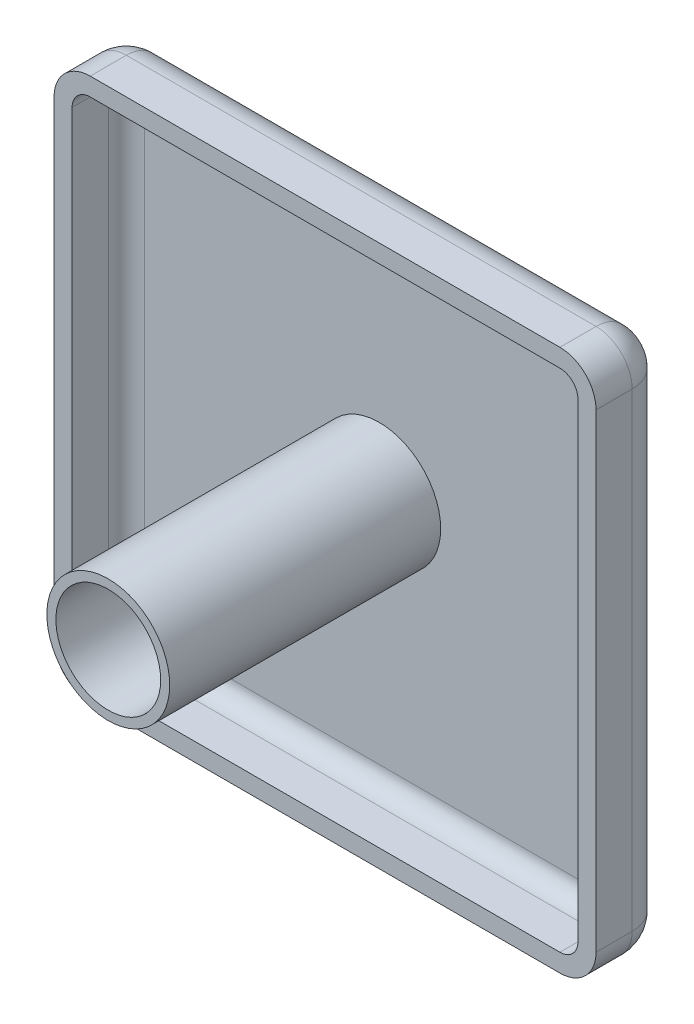
ISO-10303-21;
HEADER;
FILE_DESCRIPTION(('STEP AP214'),'2;1');
FILE_NAME('part.step','',(''),(''),'','','');
FILE_SCHEMA(('AUTOMOTIVE_DESIGN { 1 0 10303 214 1 1 1 1 }'));
ENDSEC;
DATA;
#1=APPLICATION_CONTEXT('core data for automotive mechanical design processes');
#2=APPLICATION_PROTOCOL_DEFINITION('international standard','automotive_design',2000,#1);
#3=PRODUCT_CONTEXT('',#1,'mechanical');
#4=PRODUCT('Part','Part','',(#3));
#5=PRODUCT_RELATED_PRODUCT_CATEGORY('part','',(#4));
#6=PRODUCT_DEFINITION_FORMATION('','',#4);
#7=PRODUCT_DEFINITION_CONTEXT('part definition',#1,'design');
#8=PRODUCT_DEFINITION('design','',#6,#7);
#9=PRODUCT_DEFINITION_SHAPE('','',#8);
#10=(LENGTH_UNIT() NAMED_UNIT(*) SI_UNIT(.MILLI.,.METRE.));
#11=(NAMED_UNIT(*) PLANE_ANGLE_UNIT() SI_UNIT($,.RADIAN.));
#12=(NAMED_UNIT(*) SI_UNIT($,.STERADIAN.) SOLID_ANGLE_UNIT());
#13=UNCERTAINTY_MEASURE_WITH_UNIT(LENGTH_MEASURE(1.E-05),#10,'distance_accuracy_value','');
#14=(GEOMETRIC_REPRESENTATION_CONTEXT(3) GLOBAL_UNCERTAINTY_ASSIGNED_CONTEXT((#13)) GLOBAL_UNIT_ASSIGNED_CONTEXT((#10,
#11,#12)) REPRESENTATION_CONTEXT('',''));
#15=CARTESIAN_POINT('',(0.,0.,0.));
#16=DIRECTION('',(0.,0.,1.));
#17=DIRECTION('',(1.,0.,0.));
#18=AXIS2_PLACEMENT_3D('',#15,#16,#17);
#19=CARTESIAN_POINT('',(15.,-15.,1.));
#20=DIRECTION('',(0.,0.,1.));
#21=DIRECTION('',(1.,0.,0.));
#22=AXIS2_PLACEMENT_3D('',#19,#20,#21);
#23=PLANE('',#22);
#24=DIRECTION('',(0.,1.,0.));
#25=VECTOR('',#24,1.);
#26=CARTESIAN_POINT('',(-13.,-15.,1.));
#27=LINE('',#26,#25);
#28=CARTESIAN_POINT('',(-13.,-13.,1.));
#29=VERTEX_POINT('',#28);
#30=CARTESIAN_POINT('',(-13.,13.,1.));
#31=VERTEX_POINT('',#30);
#32=EDGE_CURVE('E236',#29,#31,#27,.T.);
#33=ORIENTED_EDGE('',*,*,#32,.F.);
#34=DIRECTION('',(1.,0.,0.));
#35=VECTOR('',#34,1.);
#36=CARTESIAN_POINT('',(15.,-13.,1.));
#37=LINE('',#36,#35);
#38=CARTESIAN_POINT('',(13.,-13.,1.));
#39=VERTEX_POINT('',#38);
#40=EDGE_CURVE('E238',#39,#29,#37,.F.);
#41=ORIENTED_EDGE('',*,*,#40,.F.);
#42=DIRECTION('',(0.,1.,0.));
#43=VECTOR('',#42,1.);
#44=CARTESIAN_POINT('',(13.,-15.,1.));
#45=LINE('',#44,#43);
#46=CARTESIAN_POINT('',(13.,13.,1.));
#47=VERTEX_POINT('',#46);
#48=EDGE_CURVE('E204',#47,#39,#45,.F.);
#49=ORIENTED_EDGE('',*,*,#48,.F.);
#50=DIRECTION('',(1.,0.,0.));
#51=VECTOR('',#50,1.);
#52=CARTESIAN_POINT('',(15.,13.,1.));
#53=LINE('',#52,#51);
#54=EDGE_CURVE('E230',#31,#47,#53,.T.);
#55=ORIENTED_EDGE('',*,*,#54,.F.);
#56=EDGE_LOOP('',(#33,#41,#49,#55));
#57=FACE_BOUND('',#56,.T.);
#58=CARTESIAN_POINT('',(0.,0.,1.));
#59=DIRECTION('',(0.,0.,1.));
#60=DIRECTION('',(1.,0.,0.));
#61=AXIS2_PLACEMENT_3D('',#58,#59,#60);
#62=CIRCLE('',#61,3.4);
#63=CARTESIAN_POINT('',(3.4,0.,1.));
#64=VERTEX_POINT('',#63);
#65=EDGE_CURVE('E674',#64,#64,#62,.T.);
#66=ORIENTED_EDGE('',*,*,#65,.F.);
#67=EDGE_LOOP('',(#66));
#68=FACE_BOUND('',#67,.T.);
#69=ADVANCED_FACE('F35',(#57,#68),#23,.T.);
#70=CARTESIAN_POINT('',(15.,15.,4.));
#71=DIRECTION('',(-1.,0.,0.));
#72=DIRECTION('',(0.,-1.,0.));
#73=AXIS2_PLACEMENT_3D('',#70,#71,#72);
#74=PLANE('',#73);
#75=DIRECTION('',(0.,1.,0.));
#76=VECTOR('',#75,1.);
#77=CARTESIAN_POINT('',(15.,15.,4.));
#78=LINE('',#77,#76);
#79=CARTESIAN_POINT('',(15.,-13.,4.));
#80=VERTEX_POINT('',#79);
#81=CARTESIAN_POINT('',(15.,13.,4.));
#82=VERTEX_POINT('',#81);
#83=EDGE_CURVE('E282',#80,#82,#78,.T.);
#84=ORIENTED_EDGE('',*,*,#83,.F.);
#85=DIRECTION('',(0.,0.,-1.));
#86=VECTOR('',#85,1.);
#87=CARTESIAN_POINT('',(15.,-13.,4.));
#88=LINE('',#87,#86);
#89=CARTESIAN_POINT('',(15.,-13.,2.));
#90=VERTEX_POINT('',#89);
#91=EDGE_CURVE('E60',#80,#90,#88,.T.);
#92=ORIENTED_EDGE('',*,*,#91,.T.);
#93=DIRECTION('',(0.,1.,0.));
#94=VECTOR('',#93,1.);
#95=CARTESIAN_POINT('',(15.,15.,2.));
#96=LINE('',#95,#94);
#97=CARTESIAN_POINT('',(15.,13.,2.));
#98=VERTEX_POINT('',#97);
#99=EDGE_CURVE('E324',#90,#98,#96,.T.);
#100=ORIENTED_EDGE('',*,*,#99,.T.);
#101=DIRECTION('',(0.,0.,-1.));
#102=VECTOR('',#101,1.);
#103=CARTESIAN_POINT('',(15.,13.,4.));
#104=LINE('',#103,#102);
#105=EDGE_CURVE('E322',#98,#82,#104,.F.);
#106=ORIENTED_EDGE('',*,*,#105,.T.);
#107=EDGE_LOOP('',(#84,#92,#100,#106));
#108=FACE_BOUND('',#107,.T.);
#109=ADVANCED_FACE('F374',(#108),#74,.F.);
#110=CARTESIAN_POINT('',(-15.,15.,4.));
#111=DIRECTION('',(0.,-1.,0.));
#112=DIRECTION('',(0.,0.,-1.));
#113=AXIS2_PLACEMENT_3D('',#110,#111,#112);
#114=PLANE('',#113);
#115=DIRECTION('',(-1.,0.,0.));
#116=VECTOR('',#115,1.);
#117=CARTESIAN_POINT('',(-15.,15.,4.));
#118=LINE('',#117,#116);
#119=CARTESIAN_POINT('',(13.,15.,4.));
#120=VERTEX_POINT('',#119);
#121=CARTESIAN_POINT('',(-13.,15.,4.));
#122=VERTEX_POINT('',#121);
#123=EDGE_CURVE('E285',#120,#122,#118,.T.);
#124=ORIENTED_EDGE('',*,*,#123,.F.);
#125=DIRECTION('',(0.,0.,-1.));
#126=VECTOR('',#125,1.);
#127=CARTESIAN_POINT('',(13.,15.,4.));
#128=LINE('',#127,#126);
#129=CARTESIAN_POINT('',(13.,15.,2.));
#130=VERTEX_POINT('',#129);
#131=EDGE_CURVE('E299',#120,#130,#128,.T.);
#132=ORIENTED_EDGE('',*,*,#131,.T.);
#133=DIRECTION('',(-1.,0.,0.));
#134=VECTOR('',#133,1.);
#135=CARTESIAN_POINT('',(-15.,15.,2.));
#136=LINE('',#135,#134);
#137=CARTESIAN_POINT('',(-13.,15.,2.));
#138=VERTEX_POINT('',#137);
#139=EDGE_CURVE('E296',#130,#138,#136,.T.);
#140=ORIENTED_EDGE('',*,*,#139,.T.);
#141=DIRECTION('',(0.,0.,-1.));
#142=VECTOR('',#141,1.);
#143=CARTESIAN_POINT('',(-13.,15.,4.));
#144=LINE('',#143,#142);
#145=EDGE_CURVE('E294',#138,#122,#144,.F.);
#146=ORIENTED_EDGE('',*,*,#145,.T.);
#147=EDGE_LOOP('',(#124,#132,#140,#146));
#148=FACE_BOUND('',#147,.T.);
#149=ADVANCED_FACE('F386',(#148),#114,.F.);
#150=CARTESIAN_POINT('',(-15.,15.,4.));
#151=DIRECTION('',(1.,0.,0.));
#152=DIRECTION('',(0.,1.,0.));
#153=AXIS2_PLACEMENT_3D('',#150,#151,#152);
#154=PLANE('',#153);
#155=DIRECTION('',(0.,-1.,0.));
#156=VECTOR('',#155,1.);
#157=CARTESIAN_POINT('',(-15.,15.,2.));
#158=LINE('',#157,#156);
#159=CARTESIAN_POINT('',(-15.,13.,2.));
#160=VERTEX_POINT('',#159);
#161=CARTESIAN_POINT('',(-15.,-13.,2.));
#162=VERTEX_POINT('',#161);
#163=EDGE_CURVE('E312',#160,#162,#158,.T.);
#164=ORIENTED_EDGE('',*,*,#163,.T.);
#165=DIRECTION('',(0.,0.,-1.));
#166=VECTOR('',#165,1.);
#167=CARTESIAN_POINT('',(-15.,-13.,4.));
#168=LINE('',#167,#166);
#169=CARTESIAN_POINT('',(-15.,-13.,4.));
#170=VERTEX_POINT('',#169);
#171=EDGE_CURVE('E314',#162,#170,#168,.F.);
#172=ORIENTED_EDGE('',*,*,#171,.T.);
#173=DIRECTION('',(0.,-1.,0.));
#174=VECTOR('',#173,1.);
#175=CARTESIAN_POINT('',(-15.,15.,4.));
#176=LINE('',#175,#174);
#177=CARTESIAN_POINT('',(-15.,13.,4.));
#178=VERTEX_POINT('',#177);
#179=EDGE_CURVE('E288',#178,#170,#176,.T.);
#180=ORIENTED_EDGE('',*,*,#179,.F.);
#181=DIRECTION('',(0.,0.,-1.));
#182=VECTOR('',#181,1.);
#183=CARTESIAN_POINT('',(-15.,13.,4.));
#184=LINE('',#183,#182);
#185=EDGE_CURVE('E310',#178,#160,#184,.T.);
#186=ORIENTED_EDGE('',*,*,#185,.T.);
#187=EDGE_LOOP('',(#164,#172,#180,#186));
#188=FACE_BOUND('',#187,.T.);
#189=ADVANCED_FACE('F396',(#188),#154,.F.);
#190=CARTESIAN_POINT('',(-15.,-15.,4.));
#191=DIRECTION('',(0.,1.,0.));
#192=DIRECTION('',(0.,0.,1.));
#193=AXIS2_PLACEMENT_3D('',#190,#191,#192);
#194=PLANE('',#193);
#195=DIRECTION('',(1.,0.,0.));
#196=VECTOR('',#195,1.);
#197=CARTESIAN_POINT('',(-15.,-15.,4.));
#198=LINE('',#197,#196);
#199=CARTESIAN_POINT('',(-13.,-15.,4.));
#200=VERTEX_POINT('',#199);
#201=CARTESIAN_POINT('',(13.,-15.,4.));
#202=VERTEX_POINT('',#201);
#203=EDGE_CURVE('E291',#200,#202,#198,.T.);
#204=ORIENTED_EDGE('',*,*,#203,.F.);
#205=DIRECTION('',(0.,0.,-1.));
#206=VECTOR('',#205,1.);
#207=CARTESIAN_POINT('',(-13.,-15.,4.));
#208=LINE('',#207,#206);
#209=CARTESIAN_POINT('',(-13.,-15.,2.));
#210=VERTEX_POINT('',#209);
#211=EDGE_CURVE('E320',#200,#210,#208,.T.);
#212=ORIENTED_EDGE('',*,*,#211,.T.);
#213=DIRECTION('',(1.,0.,0.));
#214=VECTOR('',#213,1.);
#215=CARTESIAN_POINT('',(-15.,-15.,2.));
#216=LINE('',#215,#214);
#217=CARTESIAN_POINT('',(13.,-15.,2.));
#218=VERTEX_POINT('',#217);
#219=EDGE_CURVE('E318',#210,#218,#216,.T.);
#220=ORIENTED_EDGE('',*,*,#219,.T.);
#221=DIRECTION('',(0.,0.,-1.));
#222=VECTOR('',#221,1.);
#223=CARTESIAN_POINT('',(13.,-15.,4.));
#224=LINE('',#223,#222);
#225=EDGE_CURVE('E316',#218,#202,#224,.F.);
#226=ORIENTED_EDGE('',*,*,#225,.T.);
#227=EDGE_LOOP('',(#204,#212,#220,#226));
#228=FACE_BOUND('',#227,.T.);
#229=ADVANCED_FACE('F418',(#228),#194,.F.);
#230=CARTESIAN_POINT('',(15.,-15.,4.));
#231=DIRECTION('',(0.,0.,1.));
#232=DIRECTION('',(1.,0.,0.));
#233=AXIS2_PLACEMENT_3D('',#230,#231,#232);
#234=PLANE('',#233);
#235=DIRECTION('',(0.,-1.,0.));
#236=VECTOR('',#235,1.);
#237=CARTESIAN_POINT('',(-14.,15.,4.));
#238=LINE('',#237,#236);
#239=CARTESIAN_POINT('',(-14.,13.,4.));
#240=VERTEX_POINT('',#239);
#241=CARTESIAN_POINT('',(-14.,-13.,4.));
#242=VERTEX_POINT('',#241);
#243=EDGE_CURVE('E272',#240,#242,#238,.T.);
#244=ORIENTED_EDGE('',*,*,#243,.F.);
#245=CARTESIAN_POINT('',(-13.,13.,4.));
#246=DIRECTION('',(0.,0.,1.));
#247=DIRECTION('',(1.,0.,0.));
#248=AXIS2_PLACEMENT_3D('',#245,#246,#247);
#249=CIRCLE('',#248,1.);
#250=CARTESIAN_POINT('',(-13.,14.,4.));
#251=VERTEX_POINT('',#250);
#252=EDGE_CURVE('E186',#251,#240,#249,.T.);
#253=ORIENTED_EDGE('',*,*,#252,.F.);
#254=DIRECTION('',(-1.,0.,0.));
#255=VECTOR('',#254,1.);
#256=CARTESIAN_POINT('',(-15.,14.,4.));
#257=LINE('',#256,#255);
#258=CARTESIAN_POINT('',(13.,14.,4.));
#259=VERTEX_POINT('',#258);
#260=EDGE_CURVE('E52',#259,#251,#257,.T.);
#261=ORIENTED_EDGE('',*,*,#260,.F.);
#262=CARTESIAN_POINT('',(13.,13.,4.));
#263=DIRECTION('',(0.,0.,1.));
#264=DIRECTION('',(1.,0.,0.));
#265=AXIS2_PLACEMENT_3D('',#262,#263,#264);
#266=CIRCLE('',#265,1.);
#267=CARTESIAN_POINT('',(14.,13.,4.));
#268=VERTEX_POINT('',#267);
#269=EDGE_CURVE('E269',#268,#259,#266,.T.);
#270=ORIENTED_EDGE('',*,*,#269,.F.);
#271=DIRECTION('',(0.,1.,0.));
#272=VECTOR('',#271,1.);
#273=CARTESIAN_POINT('',(14.,15.,4.));
#274=LINE('',#273,#272);
#275=CARTESIAN_POINT('',(14.,-13.,4.));
#276=VERTEX_POINT('',#275);
#277=EDGE_CURVE('E244',#276,#268,#274,.T.);
#278=ORIENTED_EDGE('',*,*,#277,.F.);
#279=CARTESIAN_POINT('',(13.,-13.,4.));
#280=DIRECTION('',(0.,0.,1.));
#281=DIRECTION('',(1.,0.,0.));
#282=AXIS2_PLACEMENT_3D('',#279,#280,#281);
#283=CIRCLE('',#282,1.);
#284=CARTESIAN_POINT('',(13.,-14.,4.));
#285=VERTEX_POINT('',#284);
#286=EDGE_CURVE('E181',#285,#276,#283,.T.);
#287=ORIENTED_EDGE('',*,*,#286,.F.);
#288=DIRECTION('',(1.,0.,0.));
#289=VECTOR('',#288,1.);
#290=CARTESIAN_POINT('',(-15.,-14.,4.));
#291=LINE('',#290,#289);
#292=CARTESIAN_POINT('',(-13.,-14.,4.));
#293=VERTEX_POINT('',#292);
#294=EDGE_CURVE('E257',#293,#285,#291,.T.);
#295=ORIENTED_EDGE('',*,*,#294,.F.);
#296=CARTESIAN_POINT('',(-13.,-13.,4.));
#297=DIRECTION('',(0.,0.,1.));
#298=DIRECTION('',(1.,0.,0.));
#299=AXIS2_PLACEMENT_3D('',#296,#297,#298);
#300=CIRCLE('',#299,1.);
#301=EDGE_CURVE('E276',#242,#293,#300,.T.);
#302=ORIENTED_EDGE('',*,*,#301,.F.);
#303=EDGE_LOOP('',(#244,#253,#261,#270,#278,#287,#295,#302));
#304=FACE_BOUND('',#303,.T.);
#305=ORIENTED_EDGE('',*,*,#179,.T.);
#306=CARTESIAN_POINT('',(-13.,-13.,4.));
#307=DIRECTION('',(0.,0.,1.));
#308=DIRECTION('',(1.,0.,0.));
#309=AXIS2_PLACEMENT_3D('',#306,#307,#308);
#310=CIRCLE('',#309,2.);
#311=EDGE_CURVE('E11',#170,#200,#310,.T.);
#312=ORIENTED_EDGE('',*,*,#311,.T.);
#313=ORIENTED_EDGE('',*,*,#203,.T.);
#314=CARTESIAN_POINT('',(13.,-13.,4.));
#315=DIRECTION('',(0.,0.,1.));
#316=DIRECTION('',(1.,0.,0.));
#317=AXIS2_PLACEMENT_3D('',#314,#315,#316);
#318=CIRCLE('',#317,2.);
#319=EDGE_CURVE('E44',#202,#80,#318,.T.);
#320=ORIENTED_EDGE('',*,*,#319,.T.);
#321=ORIENTED_EDGE('',*,*,#83,.T.);
#322=CARTESIAN_POINT('',(13.,13.,4.));
#323=DIRECTION('',(0.,0.,1.));
#324=DIRECTION('',(1.,0.,0.));
#325=AXIS2_PLACEMENT_3D('',#322,#323,#324);
#326=CIRCLE('',#325,2.);
#327=EDGE_CURVE('E329',#82,#120,#326,.T.);
#328=ORIENTED_EDGE('',*,*,#327,.T.);
#329=ORIENTED_EDGE('',*,*,#123,.T.);
#330=CARTESIAN_POINT('',(-13.,13.,4.));
#331=DIRECTION('',(0.,0.,1.));
#332=DIRECTION('',(1.,0.,0.));
#333=AXIS2_PLACEMENT_3D('',#330,#331,#332);
#334=CIRCLE('',#333,2.);
#335=EDGE_CURVE('E327',#122,#178,#334,.T.);
#336=ORIENTED_EDGE('',*,*,#335,.T.);
#337=EDGE_LOOP('',(#305,#312,#313,#320,#321,#328,#329,#336));
#338=FACE_BOUND('',#337,.T.);
#339=ADVANCED_FACE('F383',(#304,#338),#234,.T.);
#340=CARTESIAN_POINT('',(15.,-15.,0.));
#341=DIRECTION('',(0.,0.,1.));
#342=DIRECTION('',(1.,0.,0.));
#343=AXIS2_PLACEMENT_3D('',#340,#341,#342);
#344=PLANE('',#343);
#345=DIRECTION('',(0.,-1.,0.));
#346=VECTOR('',#345,1.);
#347=CARTESIAN_POINT('',(-13.,-15.,0.));
#348=LINE('',#347,#346);
#349=CARTESIAN_POINT('',(-13.,-13.,0.));
#350=VERTEX_POINT('',#349);
#351=CARTESIAN_POINT('',(-13.,13.,0.));
#352=VERTEX_POINT('',#351);
#353=EDGE_CURVE('E305',#350,#352,#348,.F.);
#354=ORIENTED_EDGE('',*,*,#353,.T.);
#355=DIRECTION('',(-1.,0.,0.));
#356=VECTOR('',#355,1.);
#357=CARTESIAN_POINT('',(15.,13.,0.));
#358=LINE('',#357,#356);
#359=CARTESIAN_POINT('',(13.,13.,0.));
#360=VERTEX_POINT('',#359);
#361=EDGE_CURVE('E307',#352,#360,#358,.F.);
#362=ORIENTED_EDGE('',*,*,#361,.T.);
#363=DIRECTION('',(0.,1.,0.));
#364=VECTOR('',#363,1.);
#365=CARTESIAN_POINT('',(13.,-15.,0.));
#366=LINE('',#365,#364);
#367=CARTESIAN_POINT('',(13.,-13.,0.));
#368=VERTEX_POINT('',#367);
#369=EDGE_CURVE('E301',#360,#368,#366,.F.);
#370=ORIENTED_EDGE('',*,*,#369,.T.);
#371=DIRECTION('',(1.,0.,0.));
#372=VECTOR('',#371,1.);
#373=CARTESIAN_POINT('',(15.,-13.,0.));
#374=LINE('',#373,#372);
#375=EDGE_CURVE('E303',#368,#350,#374,.F.);
#376=ORIENTED_EDGE('',*,*,#375,.T.);
#377=EDGE_LOOP('',(#354,#362,#370,#376));
#378=FACE_BOUND('',#377,.T.);
#379=ADVANCED_FACE('F413',(#378),#344,.F.);
#380=CARTESIAN_POINT('',(13.,-13.,4.));
#381=DIRECTION('',(0.,0.,-1.));
#382=DIRECTION('',(-1.,0.,0.));
#383=AXIS2_PLACEMENT_3D('',#380,#381,#382);
#384=CYLINDRICAL_SURFACE('',#383,2.);
#385=ORIENTED_EDGE('',*,*,#319,.F.);
#386=ORIENTED_EDGE('',*,*,#225,.F.);
#387=CARTESIAN_POINT('',(13.,-13.,2.));
#388=DIRECTION('',(0.,0.,-1.));
#389=DIRECTION('',(-1.,0.,0.));
#390=AXIS2_PLACEMENT_3D('',#387,#388,#389);
#391=CIRCLE('',#390,2.);
#392=EDGE_CURVE('E358',#90,#218,#391,.T.);
#393=ORIENTED_EDGE('',*,*,#392,.F.);
#394=ORIENTED_EDGE('',*,*,#91,.F.);
#395=EDGE_LOOP('',(#385,#386,#393,#394));
#396=FACE_BOUND('',#395,.T.);
#397=ADVANCED_FACE('F37',(#396),#384,.T.);
#398=CARTESIAN_POINT('',(-13.,-13.,4.));
#399=DIRECTION('',(0.,0.,-1.));
#400=DIRECTION('',(-1.,0.,0.));
#401=AXIS2_PLACEMENT_3D('',#398,#399,#400);
#402=CYLINDRICAL_SURFACE('',#401,2.);
#403=ORIENTED_EDGE('',*,*,#311,.F.);
#404=ORIENTED_EDGE('',*,*,#171,.F.);
#405=CARTESIAN_POINT('',(-13.,-13.,2.));
#406=DIRECTION('',(0.,0.,-1.));
#407=DIRECTION('',(-1.,0.,0.));
#408=AXIS2_PLACEMENT_3D('',#405,#406,#407);
#409=CIRCLE('',#408,2.);
#410=EDGE_CURVE('E356',#210,#162,#409,.T.);
#411=ORIENTED_EDGE('',*,*,#410,.F.);
#412=ORIENTED_EDGE('',*,*,#211,.F.);
#413=EDGE_LOOP('',(#403,#404,#411,#412));
#414=FACE_BOUND('',#413,.T.);
#415=ADVANCED_FACE('F401',(#414),#402,.T.);
#416=CARTESIAN_POINT('',(-15.,-13.,2.));
#417=DIRECTION('',(1.,0.,0.));
#418=DIRECTION('',(0.,0.,-1.));
#419=AXIS2_PLACEMENT_3D('',#416,#417,#418);
#420=CYLINDRICAL_SURFACE('',#419,2.);
#421=CARTESIAN_POINT('',(13.,-13.,2.));
#422=DIRECTION('',(1.,0.,0.));
#423=DIRECTION('',(0.,0.,-1.));
#424=AXIS2_PLACEMENT_3D('',#421,#422,#423);
#425=CIRCLE('',#424,2.);
#426=EDGE_CURVE('E39',#218,#368,#425,.T.);
#427=ORIENTED_EDGE('',*,*,#426,.F.);
#428=ORIENTED_EDGE('',*,*,#219,.F.);
#429=CARTESIAN_POINT('',(-13.,-13.,2.));
#430=DIRECTION('',(-1.,0.,0.));
#431=DIRECTION('',(0.,0.,1.));
#432=AXIS2_PLACEMENT_3D('',#429,#430,#431);
#433=CIRCLE('',#432,2.);
#434=EDGE_CURVE('E353',#350,#210,#433,.T.);
#435=ORIENTED_EDGE('',*,*,#434,.F.);
#436=ORIENTED_EDGE('',*,*,#375,.F.);
#437=EDGE_LOOP('',(#427,#428,#435,#436));
#438=FACE_BOUND('',#437,.T.);
#439=ADVANCED_FACE('F414',(#438),#420,.T.);
#440=CARTESIAN_POINT('',(13.,-13.,2.));
#441=DIRECTION('',(0.,0.,1.));
#442=DIRECTION('',(1.,0.,0.));
#443=AXIS2_PLACEMENT_3D('',#440,#441,#442);
#444=SPHERICAL_SURFACE('',#443,2.);
#445=ORIENTED_EDGE('',*,*,#392,.T.);
#446=ORIENTED_EDGE('',*,*,#426,.T.);
#447=CARTESIAN_POINT('',(13.,-13.,2.));
#448=DIRECTION('',(0.,-1.,0.));
#449=DIRECTION('',(1.,0.,0.));
#450=AXIS2_PLACEMENT_3D('',#447,#448,#449);
#451=CIRCLE('',#450,2.);
#452=EDGE_CURVE('E350',#90,#368,#451,.F.);
#453=ORIENTED_EDGE('',*,*,#452,.F.);
#454=EDGE_LOOP('',(#445,#446,#453));
#455=FACE_BOUND('',#454,.T.);
#456=ADVANCED_FACE('F364',(#455),#444,.T.);
#457=CARTESIAN_POINT('',(-13.,-13.,2.));
#458=DIRECTION('',(0.,0.,1.));
#459=DIRECTION('',(1.,0.,0.));
#460=AXIS2_PLACEMENT_3D('',#457,#458,#459);
#461=SPHERICAL_SURFACE('',#460,2.);
#462=ORIENTED_EDGE('',*,*,#434,.T.);
#463=ORIENTED_EDGE('',*,*,#410,.T.);
#464=CARTESIAN_POINT('',(-13.,-13.,2.));
#465=DIRECTION('',(0.,-1.,0.));
#466=DIRECTION('',(0.,0.,-1.));
#467=AXIS2_PLACEMENT_3D('',#464,#465,#466);
#468=CIRCLE('',#467,2.);
#469=EDGE_CURVE('E347',#350,#162,#468,.F.);
#470=ORIENTED_EDGE('',*,*,#469,.F.);
#471=EDGE_LOOP('',(#462,#463,#470));
#472=FACE_BOUND('',#471,.T.);
#473=ADVANCED_FACE('F405',(#472),#461,.T.);
#474=CARTESIAN_POINT('',(13.,15.,2.));
#475=DIRECTION('',(0.,1.,0.));
#476=DIRECTION('',(-1.,0.,0.));
#477=AXIS2_PLACEMENT_3D('',#474,#475,#476);
#478=CYLINDRICAL_SURFACE('',#477,2.);
#479=ORIENTED_EDGE('',*,*,#452,.T.);
#480=ORIENTED_EDGE('',*,*,#369,.F.);
#481=CARTESIAN_POINT('',(13.,13.,2.));
#482=DIRECTION('',(0.,1.,0.));
#483=DIRECTION('',(0.,0.,1.));
#484=AXIS2_PLACEMENT_3D('',#481,#482,#483);
#485=CIRCLE('',#484,2.);
#486=EDGE_CURVE('E344',#98,#360,#485,.T.);
#487=ORIENTED_EDGE('',*,*,#486,.F.);
#488=ORIENTED_EDGE('',*,*,#99,.F.);
#489=EDGE_LOOP('',(#479,#480,#487,#488));
#490=FACE_BOUND('',#489,.T.);
#491=ADVANCED_FACE('F371',(#490),#478,.T.);
#492=CARTESIAN_POINT('',(13.,13.,4.));
#493=DIRECTION('',(0.,0.,-1.));
#494=DIRECTION('',(-1.,0.,0.));
#495=AXIS2_PLACEMENT_3D('',#492,#493,#494);
#496=CYLINDRICAL_SURFACE('',#495,2.);
#497=ORIENTED_EDGE('',*,*,#327,.F.);
#498=ORIENTED_EDGE('',*,*,#105,.F.);
#499=CARTESIAN_POINT('',(13.,13.,2.));
#500=DIRECTION('',(0.,0.,-1.));
#501=DIRECTION('',(-1.,0.,0.));
#502=AXIS2_PLACEMENT_3D('',#499,#500,#501);
#503=CIRCLE('',#502,2.);
#504=EDGE_CURVE('E341',#130,#98,#503,.T.);
#505=ORIENTED_EDGE('',*,*,#504,.F.);
#506=ORIENTED_EDGE('',*,*,#131,.F.);
#507=EDGE_LOOP('',(#497,#498,#505,#506));
#508=FACE_BOUND('',#507,.T.);
#509=ADVANCED_FACE('F378',(#508),#496,.T.);
#510=CARTESIAN_POINT('',(-13.,13.,4.));
#511=DIRECTION('',(0.,0.,-1.));
#512=DIRECTION('',(-1.,0.,0.));
#513=AXIS2_PLACEMENT_3D('',#510,#511,#512);
#514=CYLINDRICAL_SURFACE('',#513,2.);
#515=ORIENTED_EDGE('',*,*,#335,.F.);
#516=ORIENTED_EDGE('',*,*,#145,.F.);
#517=CARTESIAN_POINT('',(-13.,13.,2.));
#518=DIRECTION('',(0.,0.,-1.));
#519=DIRECTION('',(-1.,0.,0.));
#520=AXIS2_PLACEMENT_3D('',#517,#518,#519);
#521=CIRCLE('',#520,2.);
#522=EDGE_CURVE('E338',#160,#138,#521,.T.);
#523=ORIENTED_EDGE('',*,*,#522,.F.);
#524=ORIENTED_EDGE('',*,*,#185,.F.);
#525=EDGE_LOOP('',(#515,#516,#523,#524));
#526=FACE_BOUND('',#525,.T.);
#527=ADVANCED_FACE('F391',(#526),#514,.T.);
#528=CARTESIAN_POINT('',(-13.,15.,2.));
#529=DIRECTION('',(0.,-1.,0.));
#530=DIRECTION('',(1.,0.,0.));
#531=AXIS2_PLACEMENT_3D('',#528,#529,#530);
#532=CYLINDRICAL_SURFACE('',#531,2.);
#533=ORIENTED_EDGE('',*,*,#469,.T.);
#534=ORIENTED_EDGE('',*,*,#163,.F.);
#535=CARTESIAN_POINT('',(-13.,13.,2.));
#536=DIRECTION('',(0.,1.,0.));
#537=DIRECTION('',(0.,0.,1.));
#538=AXIS2_PLACEMENT_3D('',#535,#536,#537);
#539=CIRCLE('',#538,2.);
#540=EDGE_CURVE('E335',#352,#160,#539,.T.);
#541=ORIENTED_EDGE('',*,*,#540,.F.);
#542=ORIENTED_EDGE('',*,*,#353,.F.);
#543=EDGE_LOOP('',(#533,#534,#541,#542));
#544=FACE_BOUND('',#543,.T.);
#545=ADVANCED_FACE('F409',(#544),#532,.T.);
#546=CARTESIAN_POINT('',(13.,13.,2.));
#547=DIRECTION('',(0.,0.,1.));
#548=DIRECTION('',(1.,0.,0.));
#549=AXIS2_PLACEMENT_3D('',#546,#547,#548);
#550=SPHERICAL_SURFACE('',#549,2.);
#551=ORIENTED_EDGE('',*,*,#504,.T.);
#552=ORIENTED_EDGE('',*,*,#486,.T.);
#553=CARTESIAN_POINT('',(13.,13.,2.));
#554=DIRECTION('',(1.,0.,0.));
#555=DIRECTION('',(0.,1.,0.));
#556=AXIS2_PLACEMENT_3D('',#553,#554,#555);
#557=CIRCLE('',#556,2.);
#558=EDGE_CURVE('E333',#130,#360,#557,.F.);
#559=ORIENTED_EDGE('',*,*,#558,.F.);
#560=EDGE_LOOP('',(#551,#552,#559));
#561=FACE_BOUND('',#560,.T.);
#562=ADVANCED_FACE('F499',(#561),#550,.T.);
#563=CARTESIAN_POINT('',(-13.,13.,2.));
#564=DIRECTION('',(0.,0.,1.));
#565=DIRECTION('',(1.,0.,0.));
#566=AXIS2_PLACEMENT_3D('',#563,#564,#565);
#567=SPHERICAL_SURFACE('',#566,2.);
#568=ORIENTED_EDGE('',*,*,#540,.T.);
#569=ORIENTED_EDGE('',*,*,#522,.T.);
#570=CARTESIAN_POINT('',(-13.,13.,2.));
#571=DIRECTION('',(-1.,0.,0.));
#572=DIRECTION('',(0.,0.,1.));
#573=AXIS2_PLACEMENT_3D('',#570,#571,#572);
#574=CIRCLE('',#573,2.);
#575=EDGE_CURVE('E278',#352,#138,#574,.F.);
#576=ORIENTED_EDGE('',*,*,#575,.F.);
#577=EDGE_LOOP('',(#568,#569,#576));
#578=FACE_BOUND('',#577,.T.);
#579=ADVANCED_FACE('F495',(#578),#567,.T.);
#580=CARTESIAN_POINT('',(-15.,13.,2.));
#581=DIRECTION('',(-1.,0.,0.));
#582=DIRECTION('',(0.,0.,1.));
#583=AXIS2_PLACEMENT_3D('',#580,#581,#582);
#584=CYLINDRICAL_SURFACE('',#583,2.);
#585=ORIENTED_EDGE('',*,*,#558,.T.);
#586=ORIENTED_EDGE('',*,*,#361,.F.);
#587=ORIENTED_EDGE('',*,*,#575,.T.);
#588=ORIENTED_EDGE('',*,*,#139,.F.);
#589=EDGE_LOOP('',(#585,#586,#587,#588));
#590=FACE_BOUND('',#589,.T.);
#591=ADVANCED_FACE('F492',(#590),#584,.T.);
#592=CARTESIAN_POINT('',(14.,15.,4.));
#593=DIRECTION('',(-1.,0.,0.));
#594=DIRECTION('',(0.,-1.,0.));
#595=AXIS2_PLACEMENT_3D('',#592,#593,#594);
#596=PLANE('',#595);
#597=ORIENTED_EDGE('',*,*,#277,.T.);
#598=DIRECTION('',(0.,0.,1.));
#599=VECTOR('',#598,1.);
#600=CARTESIAN_POINT('',(14.,13.,4.));
#601=LINE('',#600,#599);
#602=CARTESIAN_POINT('',(14.,13.,2.));
#603=VERTEX_POINT('',#602);
#604=EDGE_CURVE('E210',#603,#268,#601,.T.);
#605=ORIENTED_EDGE('',*,*,#604,.F.);
#606=DIRECTION('',(0.,-1.,0.));
#607=VECTOR('',#606,1.);
#608=CARTESIAN_POINT('',(14.,15.,2.));
#609=LINE('',#608,#607);
#610=CARTESIAN_POINT('',(14.,-13.,2.));
#611=VERTEX_POINT('',#610);
#612=EDGE_CURVE('E187',#611,#603,#609,.F.);
#613=ORIENTED_EDGE('',*,*,#612,.F.);
#614=DIRECTION('',(0.,0.,1.));
#615=VECTOR('',#614,1.);
#616=CARTESIAN_POINT('',(14.,-13.,4.));
#617=LINE('',#616,#615);
#618=EDGE_CURVE('E176',#276,#611,#617,.F.);
#619=ORIENTED_EDGE('',*,*,#618,.F.);
#620=EDGE_LOOP('',(#597,#605,#613,#619));
#621=FACE_BOUND('',#620,.T.);
#622=ADVANCED_FACE('F209',(#621),#596,.T.);
#623=CARTESIAN_POINT('',(-15.,14.,4.));
#624=DIRECTION('',(0.,-1.,0.));
#625=DIRECTION('',(0.,0.,-1.));
#626=AXIS2_PLACEMENT_3D('',#623,#624,#625);
#627=PLANE('',#626);
#628=ORIENTED_EDGE('',*,*,#260,.T.);
#629=DIRECTION('',(0.,0.,-1.));
#630=VECTOR('',#629,1.);
#631=CARTESIAN_POINT('',(-13.,14.,4.));
#632=LINE('',#631,#630);
#633=CARTESIAN_POINT('',(-13.,14.,2.));
#634=VERTEX_POINT('',#633);
#635=EDGE_CURVE('E255',#634,#251,#632,.F.);
#636=ORIENTED_EDGE('',*,*,#635,.F.);
#637=DIRECTION('',(1.,0.,0.));
#638=VECTOR('',#637,1.);
#639=CARTESIAN_POINT('',(-15.,14.,2.));
#640=LINE('',#639,#638);
#641=CARTESIAN_POINT('',(13.,14.,2.));
#642=VERTEX_POINT('',#641);
#643=EDGE_CURVE('E252',#642,#634,#640,.F.);
#644=ORIENTED_EDGE('',*,*,#643,.F.);
#645=DIRECTION('',(0.,0.,-1.));
#646=VECTOR('',#645,1.);
#647=CARTESIAN_POINT('',(13.,14.,4.));
#648=LINE('',#647,#646);
#649=EDGE_CURVE('E242',#259,#642,#648,.T.);
#650=ORIENTED_EDGE('',*,*,#649,.F.);
#651=EDGE_LOOP('',(#628,#636,#644,#650));
#652=FACE_BOUND('',#651,.T.);
#653=ADVANCED_FACE('F564',(#652),#627,.T.);
#654=CARTESIAN_POINT('',(-14.,15.,4.));
#655=DIRECTION('',(1.,0.,0.));
#656=DIRECTION('',(0.,1.,0.));
#657=AXIS2_PLACEMENT_3D('',#654,#655,#656);
#658=PLANE('',#657);
#659=DIRECTION('',(0.,1.,0.));
#660=VECTOR('',#659,1.);
#661=CARTESIAN_POINT('',(-14.,15.,2.));
#662=LINE('',#661,#660);
#663=CARTESIAN_POINT('',(-14.,13.,2.));
#664=VERTEX_POINT('',#663);
#665=CARTESIAN_POINT('',(-14.,-13.,2.));
#666=VERTEX_POINT('',#665);
#667=EDGE_CURVE('E224',#664,#666,#662,.F.);
#668=ORIENTED_EDGE('',*,*,#667,.F.);
#669=DIRECTION('',(0.,0.,1.));
#670=VECTOR('',#669,1.);
#671=CARTESIAN_POINT('',(-14.,13.,4.));
#672=LINE('',#671,#670);
#673=EDGE_CURVE('E228',#240,#664,#672,.F.);
#674=ORIENTED_EDGE('',*,*,#673,.F.);
#675=ORIENTED_EDGE('',*,*,#243,.T.);
#676=DIRECTION('',(0.,0.,1.));
#677=VECTOR('',#676,1.);
#678=CARTESIAN_POINT('',(-14.,-13.,4.));
#679=LINE('',#678,#677);
#680=EDGE_CURVE('E219',#666,#242,#679,.T.);
#681=ORIENTED_EDGE('',*,*,#680,.F.);
#682=EDGE_LOOP('',(#668,#674,#675,#681));
#683=FACE_BOUND('',#682,.T.);
#684=ADVANCED_FACE('F571',(#683),#658,.T.);
#685=CARTESIAN_POINT('',(-15.,-14.,4.));
#686=DIRECTION('',(0.,1.,0.));
#687=DIRECTION('',(0.,0.,1.));
#688=AXIS2_PLACEMENT_3D('',#685,#686,#687);
#689=PLANE('',#688);
#690=ORIENTED_EDGE('',*,*,#294,.T.);
#691=DIRECTION('',(0.,0.,1.));
#692=VECTOR('',#691,1.);
#693=CARTESIAN_POINT('',(13.,-14.,4.));
#694=LINE('',#693,#692);
#695=CARTESIAN_POINT('',(13.,-14.,2.));
#696=VERTEX_POINT('',#695);
#697=EDGE_CURVE('E217',#696,#285,#694,.T.);
#698=ORIENTED_EDGE('',*,*,#697,.F.);
#699=DIRECTION('',(1.,0.,0.));
#700=VECTOR('',#699,1.);
#701=CARTESIAN_POINT('',(-15.,-14.,2.));
#702=LINE('',#701,#700);
#703=CARTESIAN_POINT('',(-13.,-14.,2.));
#704=VERTEX_POINT('',#703);
#705=EDGE_CURVE('E218',#704,#696,#702,.T.);
#706=ORIENTED_EDGE('',*,*,#705,.F.);
#707=DIRECTION('',(0.,0.,1.));
#708=VECTOR('',#707,1.);
#709=CARTESIAN_POINT('',(-13.,-14.,4.));
#710=LINE('',#709,#708);
#711=EDGE_CURVE('E213',#293,#704,#710,.F.);
#712=ORIENTED_EDGE('',*,*,#711,.F.);
#713=EDGE_LOOP('',(#690,#698,#706,#712));
#714=FACE_BOUND('',#713,.T.);
#715=ADVANCED_FACE('F438',(#714),#689,.T.);
#716=CARTESIAN_POINT('',(13.,-13.,4.));
#717=DIRECTION('',(0.,0.,-1.));
#718=DIRECTION('',(-1.,0.,0.));
#719=AXIS2_PLACEMENT_3D('',#716,#717,#718);
#720=CYLINDRICAL_SURFACE('',#719,1.);
#721=ORIENTED_EDGE('',*,*,#286,.T.);
#722=ORIENTED_EDGE('',*,*,#618,.T.);
#723=CARTESIAN_POINT('',(13.,-13.,2.));
#724=DIRECTION('',(0.,0.,1.));
#725=DIRECTION('',(1.,0.,0.));
#726=AXIS2_PLACEMENT_3D('',#723,#724,#725);
#727=CIRCLE('',#726,1.);
#728=EDGE_CURVE('E179',#611,#696,#727,.F.);
#729=ORIENTED_EDGE('',*,*,#728,.T.);
#730=ORIENTED_EDGE('',*,*,#697,.T.);
#731=EDGE_LOOP('',(#721,#722,#729,#730));
#732=FACE_BOUND('',#731,.T.);
#733=ADVANCED_FACE('F178',(#732),#720,.F.);
#734=CARTESIAN_POINT('',(-13.,-13.,4.));
#735=DIRECTION('',(0.,0.,-1.));
#736=DIRECTION('',(-1.,0.,0.));
#737=AXIS2_PLACEMENT_3D('',#734,#735,#736);
#738=CYLINDRICAL_SURFACE('',#737,1.);
#739=ORIENTED_EDGE('',*,*,#301,.T.);
#740=ORIENTED_EDGE('',*,*,#711,.T.);
#741=CARTESIAN_POINT('',(-13.,-13.,2.));
#742=DIRECTION('',(0.,0.,1.));
#743=DIRECTION('',(1.,0.,0.));
#744=AXIS2_PLACEMENT_3D('',#741,#742,#743);
#745=CIRCLE('',#744,1.);
#746=EDGE_CURVE('E197',#704,#666,#745,.F.);
#747=ORIENTED_EDGE('',*,*,#746,.T.);
#748=ORIENTED_EDGE('',*,*,#680,.T.);
#749=EDGE_LOOP('',(#739,#740,#747,#748));
#750=FACE_BOUND('',#749,.T.);
#751=ADVANCED_FACE('F442',(#750),#738,.F.);
#752=CARTESIAN_POINT('',(-15.,-13.,2.));
#753=DIRECTION('',(1.,0.,0.));
#754=DIRECTION('',(0.,0.,-1.));
#755=AXIS2_PLACEMENT_3D('',#752,#753,#754);
#756=CYLINDRICAL_SURFACE('',#755,1.);
#757=CARTESIAN_POINT('',(13.,-13.,2.));
#758=DIRECTION('',(-1.,0.,0.));
#759=DIRECTION('',(0.,-1.,0.));
#760=AXIS2_PLACEMENT_3D('',#757,#758,#759);
#761=CIRCLE('',#760,1.);
#762=EDGE_CURVE('E196',#696,#39,#761,.F.);
#763=ORIENTED_EDGE('',*,*,#762,.T.);
#764=ORIENTED_EDGE('',*,*,#40,.T.);
#765=CARTESIAN_POINT('',(-13.,-13.,2.));
#766=DIRECTION('',(-1.,0.,0.));
#767=DIRECTION('',(0.,-1.,0.));
#768=AXIS2_PLACEMENT_3D('',#765,#766,#767);
#769=CIRCLE('',#768,1.);
#770=EDGE_CURVE('E206',#29,#704,#769,.T.);
#771=ORIENTED_EDGE('',*,*,#770,.T.);
#772=ORIENTED_EDGE('',*,*,#705,.T.);
#773=EDGE_LOOP('',(#763,#764,#771,#772));
#774=FACE_BOUND('',#773,.T.);
#775=ADVANCED_FACE('F445',(#774),#756,.F.);
#776=CARTESIAN_POINT('',(13.,-13.,2.));
#777=DIRECTION('',(0.,0.,1.));
#778=DIRECTION('',(1.,0.,0.));
#779=AXIS2_PLACEMENT_3D('',#776,#777,#778);
#780=SPHERICAL_SURFACE('',#779,1.);
#781=ORIENTED_EDGE('',*,*,#728,.F.);
#782=CARTESIAN_POINT('',(13.,-13.,2.));
#783=DIRECTION('',(0.,1.,0.));
#784=DIRECTION('',(-1.,0.,0.));
#785=AXIS2_PLACEMENT_3D('',#782,#783,#784);
#786=CIRCLE('',#785,1.);
#787=EDGE_CURVE('E194',#611,#39,#786,.T.);
#788=ORIENTED_EDGE('',*,*,#787,.T.);
#789=ORIENTED_EDGE('',*,*,#762,.F.);
#790=EDGE_LOOP('',(#781,#788,#789));
#791=FACE_BOUND('',#790,.T.);
#792=ADVANCED_FACE('F193',(#791),#780,.F.);
#793=CARTESIAN_POINT('',(-13.,-13.,2.));
#794=DIRECTION('',(0.,0.,1.));
#795=DIRECTION('',(1.,0.,0.));
#796=AXIS2_PLACEMENT_3D('',#793,#794,#795);
#797=SPHERICAL_SURFACE('',#796,1.);
#798=ORIENTED_EDGE('',*,*,#770,.F.);
#799=CARTESIAN_POINT('',(-13.,-13.,2.));
#800=DIRECTION('',(0.,-1.,0.));
#801=DIRECTION('',(1.,0.,0.));
#802=AXIS2_PLACEMENT_3D('',#799,#800,#801);
#803=CIRCLE('',#802,1.);
#804=EDGE_CURVE('E207',#29,#666,#803,.F.);
#805=ORIENTED_EDGE('',*,*,#804,.T.);
#806=ORIENTED_EDGE('',*,*,#746,.F.);
#807=EDGE_LOOP('',(#798,#805,#806));
#808=FACE_BOUND('',#807,.T.);
#809=ADVANCED_FACE('F452',(#808),#797,.F.);
#810=CARTESIAN_POINT('',(13.,15.,2.));
#811=DIRECTION('',(0.,1.,0.));
#812=DIRECTION('',(-1.,0.,0.));
#813=AXIS2_PLACEMENT_3D('',#810,#811,#812);
#814=CYLINDRICAL_SURFACE('',#813,1.);
#815=ORIENTED_EDGE('',*,*,#787,.F.);
#816=ORIENTED_EDGE('',*,*,#612,.T.);
#817=CARTESIAN_POINT('',(13.,13.,2.));
#818=DIRECTION('',(0.,-1.,0.));
#819=DIRECTION('',(0.,0.,-1.));
#820=AXIS2_PLACEMENT_3D('',#817,#818,#819);
#821=CIRCLE('',#820,1.);
#822=EDGE_CURVE('E235',#603,#47,#821,.F.);
#823=ORIENTED_EDGE('',*,*,#822,.T.);
#824=ORIENTED_EDGE('',*,*,#48,.T.);
#825=EDGE_LOOP('',(#815,#816,#823,#824));
#826=FACE_BOUND('',#825,.T.);
#827=ADVANCED_FACE('F200',(#826),#814,.F.);
#828=CARTESIAN_POINT('',(13.,13.,4.));
#829=DIRECTION('',(0.,0.,-1.));
#830=DIRECTION('',(-1.,0.,0.));
#831=AXIS2_PLACEMENT_3D('',#828,#829,#830);
#832=CYLINDRICAL_SURFACE('',#831,1.);
#833=ORIENTED_EDGE('',*,*,#269,.T.);
#834=ORIENTED_EDGE('',*,*,#649,.T.);
#835=CARTESIAN_POINT('',(13.,13.,2.));
#836=DIRECTION('',(0.,0.,1.));
#837=DIRECTION('',(1.,0.,0.));
#838=AXIS2_PLACEMENT_3D('',#835,#836,#837);
#839=CIRCLE('',#838,1.);
#840=EDGE_CURVE('E247',#642,#603,#839,.F.);
#841=ORIENTED_EDGE('',*,*,#840,.T.);
#842=ORIENTED_EDGE('',*,*,#604,.T.);
#843=EDGE_LOOP('',(#833,#834,#841,#842));
#844=FACE_BOUND('',#843,.T.);
#845=ADVANCED_FACE('F458',(#844),#832,.F.);
#846=CARTESIAN_POINT('',(-13.,13.,4.));
#847=DIRECTION('',(0.,0.,-1.));
#848=DIRECTION('',(-1.,0.,0.));
#849=AXIS2_PLACEMENT_3D('',#846,#847,#848);
#850=CYLINDRICAL_SURFACE('',#849,1.);
#851=ORIENTED_EDGE('',*,*,#252,.T.);
#852=ORIENTED_EDGE('',*,*,#673,.T.);
#853=CARTESIAN_POINT('',(-13.,13.,2.));
#854=DIRECTION('',(0.,0.,1.));
#855=DIRECTION('',(1.,0.,0.));
#856=AXIS2_PLACEMENT_3D('',#853,#854,#855);
#857=CIRCLE('',#856,1.);
#858=EDGE_CURVE('E250',#664,#634,#857,.F.);
#859=ORIENTED_EDGE('',*,*,#858,.T.);
#860=ORIENTED_EDGE('',*,*,#635,.T.);
#861=EDGE_LOOP('',(#851,#852,#859,#860));
#862=FACE_BOUND('',#861,.T.);
#863=ADVANCED_FACE('F461',(#862),#850,.F.);
#864=CARTESIAN_POINT('',(-13.,15.,2.));
#865=DIRECTION('',(0.,-1.,0.));
#866=DIRECTION('',(1.,0.,0.));
#867=AXIS2_PLACEMENT_3D('',#864,#865,#866);
#868=CYLINDRICAL_SURFACE('',#867,1.);
#869=ORIENTED_EDGE('',*,*,#804,.F.);
#870=ORIENTED_EDGE('',*,*,#32,.T.);
#871=CARTESIAN_POINT('',(-13.,13.,2.));
#872=DIRECTION('',(0.,1.,0.));
#873=DIRECTION('',(-1.,0.,0.));
#874=AXIS2_PLACEMENT_3D('',#871,#872,#873);
#875=CIRCLE('',#874,1.);
#876=EDGE_CURVE('E260',#31,#664,#875,.T.);
#877=ORIENTED_EDGE('',*,*,#876,.T.);
#878=ORIENTED_EDGE('',*,*,#667,.T.);
#879=EDGE_LOOP('',(#869,#870,#877,#878));
#880=FACE_BOUND('',#879,.T.);
#881=ADVANCED_FACE('F465',(#880),#868,.F.);
#882=CARTESIAN_POINT('',(13.,13.,2.));
#883=DIRECTION('',(0.,0.,1.));
#884=DIRECTION('',(1.,0.,0.));
#885=AXIS2_PLACEMENT_3D('',#882,#883,#884);
#886=SPHERICAL_SURFACE('',#885,1.);
#887=ORIENTED_EDGE('',*,*,#840,.F.);
#888=CARTESIAN_POINT('',(13.,13.,2.));
#889=DIRECTION('',(-1.,0.,0.));
#890=DIRECTION('',(0.,0.,1.));
#891=AXIS2_PLACEMENT_3D('',#888,#889,#890);
#892=CIRCLE('',#891,1.);
#893=EDGE_CURVE('E263',#642,#47,#892,.T.);
#894=ORIENTED_EDGE('',*,*,#893,.T.);
#895=ORIENTED_EDGE('',*,*,#822,.F.);
#896=EDGE_LOOP('',(#887,#894,#895));
#897=FACE_BOUND('',#896,.T.);
#898=ADVANCED_FACE('F469',(#897),#886,.F.);
#899=CARTESIAN_POINT('',(-13.,13.,2.));
#900=DIRECTION('',(0.,0.,1.));
#901=DIRECTION('',(1.,0.,0.));
#902=AXIS2_PLACEMENT_3D('',#899,#900,#901);
#903=SPHERICAL_SURFACE('',#902,1.);
#904=ORIENTED_EDGE('',*,*,#876,.F.);
#905=CARTESIAN_POINT('',(-13.,13.,2.));
#906=DIRECTION('',(-1.,0.,0.));
#907=DIRECTION('',(0.,0.,1.));
#908=AXIS2_PLACEMENT_3D('',#905,#906,#907);
#909=CIRCLE('',#908,1.);
#910=EDGE_CURVE('E264',#31,#634,#909,.F.);
#911=ORIENTED_EDGE('',*,*,#910,.T.);
#912=ORIENTED_EDGE('',*,*,#858,.F.);
#913=EDGE_LOOP('',(#904,#911,#912));
#914=FACE_BOUND('',#913,.T.);
#915=ADVANCED_FACE('F473',(#914),#903,.F.);
#916=CARTESIAN_POINT('',(-15.,13.,2.));
#917=DIRECTION('',(-1.,0.,0.));
#918=DIRECTION('',(0.,0.,1.));
#919=AXIS2_PLACEMENT_3D('',#916,#917,#918);
#920=CYLINDRICAL_SURFACE('',#919,1.);
#921=ORIENTED_EDGE('',*,*,#893,.F.);
#922=ORIENTED_EDGE('',*,*,#643,.T.);
#923=ORIENTED_EDGE('',*,*,#910,.F.);
#924=ORIENTED_EDGE('',*,*,#54,.T.);
#925=EDGE_LOOP('',(#921,#922,#923,#924));
#926=FACE_BOUND('',#925,.T.);
#927=ADVANCED_FACE('F477',(#926),#920,.F.);
#928=CARTESIAN_POINT('',(0.,0.,16.));
#929=DIRECTION('',(0.,0.,-1.));
#930=DIRECTION('',(-1.,0.,0.));
#931=AXIS2_PLACEMENT_3D('',#928,#929,#930);
#932=CYLINDRICAL_SURFACE('',#931,3.4);
#933=CARTESIAN_POINT('',(0.,0.,16.));
#934=DIRECTION('',(0.,0.,1.));
#935=DIRECTION('',(1.,0.,0.));
#936=AXIS2_PLACEMENT_3D('',#933,#934,#935);
#937=CIRCLE('',#936,3.4);
#938=CARTESIAN_POINT('',(3.4,0.,16.));
#939=VERTEX_POINT('',#938);
#940=EDGE_CURVE('E266',#939,#939,#937,.T.);
#941=ORIENTED_EDGE('',*,*,#940,.F.);
#942=EDGE_LOOP('',(#941));
#943=FACE_BOUND('',#942,.T.);
#944=ORIENTED_EDGE('',*,*,#65,.T.);
#945=EDGE_LOOP('',(#944));
#946=FACE_BOUND('',#945,.T.);
#947=ADVANCED_FACE('F481',(#943,#946),#932,.T.);
#948=CARTESIAN_POINT('',(0.,0.,16.));
#949=DIRECTION('',(0.,0.,1.));
#950=DIRECTION('',(1.,0.,0.));
#951=AXIS2_PLACEMENT_3D('',#948,#949,#950);
#952=PLANE('',#951);
#953=CARTESIAN_POINT('',(0.,0.,16.));
#954=DIRECTION('',(0.,0.,1.));
#955=DIRECTION('',(1.,0.,0.));
#956=AXIS2_PLACEMENT_3D('',#953,#954,#955);
#957=CIRCLE('',#956,2.9);
#958=CARTESIAN_POINT('',(2.9,0.,16.));
#959=VERTEX_POINT('',#958);
#960=EDGE_CURVE('E675',#959,#959,#957,.T.);
#961=ORIENTED_EDGE('',*,*,#960,.F.);
#962=EDGE_LOOP('',(#961));
#963=FACE_BOUND('',#962,.T.);
#964=ORIENTED_EDGE('',*,*,#940,.T.);
#965=EDGE_LOOP('',(#964));
#966=FACE_BOUND('',#965,.T.);
#967=ADVANCED_FACE('F638',(#963,#966),#952,.T.);
#968=CARTESIAN_POINT('',(0.,0.,-7.20243866176395));
#969=DIRECTION('',(0.,0.,1.));
#970=DIRECTION('',(1.,0.,0.));
#971=AXIS2_PLACEMENT_3D('',#968,#969,#970);
#972=CYLINDRICAL_SURFACE('',#971,2.9);
#973=CARTESIAN_POINT('',(0.,0.,1.));
#974=DIRECTION('',(0.,0.,1.));
#975=DIRECTION('',(1.,0.,0.));
#976=AXIS2_PLACEMENT_3D('',#973,#974,#975);
#977=CIRCLE('',#976,2.9);
#978=CARTESIAN_POINT('',(2.9,0.,1.));
#979=VERTEX_POINT('',#978);
#980=EDGE_CURVE('E673',#979,#979,#977,.F.);
#981=ORIENTED_EDGE('',*,*,#980,.T.);
#982=EDGE_LOOP('',(#981));
#983=FACE_BOUND('',#982,.T.);
#984=ORIENTED_EDGE('',*,*,#960,.T.);
#985=EDGE_LOOP('',(#984));
#986=FACE_BOUND('',#985,.T.);
#987=ADVANCED_FACE('F647',(#983,#986),#972,.F.);
#988=CARTESIAN_POINT('',(15.,-15.,1.));
#989=DIRECTION('',(0.,0.,1.));
#990=DIRECTION('',(1.,0.,0.));
#991=AXIS2_PLACEMENT_3D('',#988,#989,#990);
#992=PLANE('',#991);
#993=ORIENTED_EDGE('',*,*,#980,.F.);
#994=EDGE_LOOP('',(#993));
#995=FACE_BOUND('',#994,.T.);
#996=ADVANCED_FACE('F657',(#995),#992,.T.);
#997=CLOSED_SHELL('',(#69,#109,#149,#189,#229,#339,#379,#397,#415,#439,#456,#473,#491,#509,#527,
#545,#562,#579,#591,#622,#653,#684,#715,#733,#751,#775,#792,#809,#827,#845,#863,#881,#898,#915,
#927,#947,#967,#987,#996));
#998=MANIFOLD_SOLID_BREP('B2',#997);
#999=ADVANCED_BREP_SHAPE_REPRESENTATION('',(#18,#998),#14);
#1000=SHAPE_DEFINITION_REPRESENTATION(#9,#999);
ENDSEC;
END-ISO-10303-21;
